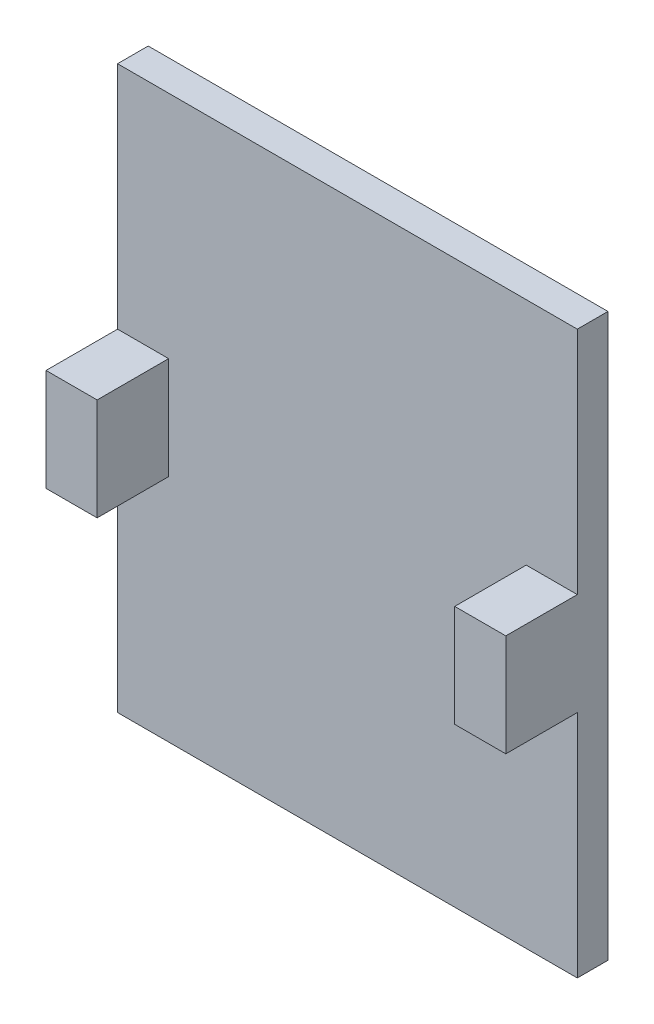
ISO-10303-21;
HEADER;
FILE_DESCRIPTION(('STEP AP214'),'2;1');
FILE_NAME('part.step','',(''),(''),'','','');
FILE_SCHEMA(('AUTOMOTIVE_DESIGN { 1 0 10303 214 1 1 1 1 }'));
ENDSEC;
DATA;
#1=APPLICATION_CONTEXT('core data for automotive mechanical design processes');
#2=APPLICATION_PROTOCOL_DEFINITION('international standard','automotive_design',2000,#1);
#3=PRODUCT_CONTEXT('',#1,'mechanical');
#4=PRODUCT('Part','Part','',(#3));
#5=PRODUCT_RELATED_PRODUCT_CATEGORY('part','',(#4));
#6=PRODUCT_DEFINITION_FORMATION('','',#4);
#7=PRODUCT_DEFINITION_CONTEXT('part definition',#1,'design');
#8=PRODUCT_DEFINITION('design','',#6,#7);
#9=PRODUCT_DEFINITION_SHAPE('','',#8);
#10=(LENGTH_UNIT() NAMED_UNIT(*) SI_UNIT(.MILLI.,.METRE.));
#11=(NAMED_UNIT(*) PLANE_ANGLE_UNIT() SI_UNIT($,.RADIAN.));
#12=(NAMED_UNIT(*) SI_UNIT($,.STERADIAN.) SOLID_ANGLE_UNIT());
#13=UNCERTAINTY_MEASURE_WITH_UNIT(LENGTH_MEASURE(1.E-05),#10,'distance_accuracy_value','');
#14=(GEOMETRIC_REPRESENTATION_CONTEXT(3) GLOBAL_UNCERTAINTY_ASSIGNED_CONTEXT((#13)) GLOBAL_UNIT_ASSIGNED_CONTEXT((#10,
#11,#12)) REPRESENTATION_CONTEXT('',''));
#15=CARTESIAN_POINT('',(0.,0.,0.));
#16=DIRECTION('',(0.,0.,1.));
#17=DIRECTION('',(1.,0.,0.));
#18=AXIS2_PLACEMENT_3D('',#15,#16,#17);
#19=CARTESIAN_POINT('',(0.,0.,3000.));
#20=DIRECTION('',(0.,0.,-1.));
#21=DIRECTION('',(-1.,0.,0.));
#22=AXIS2_PLACEMENT_3D('',#19,#20,#21);
#23=PLANE('',#22);
#24=DIRECTION('',(1.,0.,0.));
#25=VECTOR('',#24,1.);
#26=CARTESIAN_POINT('',(0.,-5000.,3000.));
#27=LINE('',#26,#25);
#28=CARTESIAN_POINT('',(-22500.,-5000.,3000.));
#29=VERTEX_POINT('',#28);
#30=CARTESIAN_POINT('',(-17500.,-5000.,3000.));
#31=VERTEX_POINT('',#30);
#32=EDGE_CURVE('E186',#29,#31,#27,.T.);
#33=ORIENTED_EDGE('',*,*,#32,.F.);
#34=DIRECTION('',(0.,-1.,0.));
#35=VECTOR('',#34,1.);
#36=CARTESIAN_POINT('',(-22500.,-27500.,3000.));
#37=LINE('',#36,#35);
#38=CARTESIAN_POINT('',(-22500.,-27500.,3000.));
#39=VERTEX_POINT('',#38);
#40=EDGE_CURVE('E149',#29,#39,#37,.T.);
#41=ORIENTED_EDGE('',*,*,#40,.T.);
#42=DIRECTION('',(1.,0.,0.));
#43=VECTOR('',#42,1.);
#44=CARTESIAN_POINT('',(-22500.,-27500.,3000.));
#45=LINE('',#44,#43);
#46=CARTESIAN_POINT('',(22500.,-27500.,3000.));
#47=VERTEX_POINT('',#46);
#48=EDGE_CURVE('E191',#39,#47,#45,.T.);
#49=ORIENTED_EDGE('',*,*,#48,.T.);
#50=DIRECTION('',(0.,1.,0.));
#51=VECTOR('',#50,1.);
#52=CARTESIAN_POINT('',(22500.,-27500.,3000.));
#53=LINE('',#52,#51);
#54=CARTESIAN_POINT('',(22500.,-5000.,3000.));
#55=VERTEX_POINT('',#54);
#56=EDGE_CURVE('E194',#47,#55,#53,.T.);
#57=ORIENTED_EDGE('',*,*,#56,.T.);
#58=DIRECTION('',(1.,0.,0.));
#59=VECTOR('',#58,1.);
#60=CARTESIAN_POINT('',(0.,-5000.,3000.));
#61=LINE('',#60,#59);
#62=CARTESIAN_POINT('',(17500.,-5000.,3000.));
#63=VERTEX_POINT('',#62);
#64=EDGE_CURVE('E153',#63,#55,#61,.T.);
#65=ORIENTED_EDGE('',*,*,#64,.F.);
#66=DIRECTION('',(0.,-1.,0.));
#67=VECTOR('',#66,1.);
#68=CARTESIAN_POINT('',(17500.,0.,3000.));
#69=LINE('',#68,#67);
#70=CARTESIAN_POINT('',(17500.,5000.,3000.));
#71=VERTEX_POINT('',#70);
#72=EDGE_CURVE('E181',#71,#63,#69,.T.);
#73=ORIENTED_EDGE('',*,*,#72,.F.);
#74=DIRECTION('',(-1.,0.,0.));
#75=VECTOR('',#74,1.);
#76=CARTESIAN_POINT('',(0.,5000.,3000.));
#77=LINE('',#76,#75);
#78=CARTESIAN_POINT('',(22500.,5000.,3000.));
#79=VERTEX_POINT('',#78);
#80=EDGE_CURVE('E150',#79,#71,#77,.T.);
#81=ORIENTED_EDGE('',*,*,#80,.F.);
#82=CARTESIAN_POINT('',(22500.,27500.,3000.));
#83=VERTEX_POINT('',#82);
#84=EDGE_CURVE('E193',#79,#83,#53,.T.);
#85=ORIENTED_EDGE('',*,*,#84,.T.);
#86=DIRECTION('',(-1.,0.,0.));
#87=VECTOR('',#86,1.);
#88=CARTESIAN_POINT('',(-22500.,27500.,3000.));
#89=LINE('',#88,#87);
#90=CARTESIAN_POINT('',(-22500.,27500.,3000.));
#91=VERTEX_POINT('',#90);
#92=EDGE_CURVE('E196',#83,#91,#89,.T.);
#93=ORIENTED_EDGE('',*,*,#92,.T.);
#94=CARTESIAN_POINT('',(-22500.,5000.,3000.));
#95=VERTEX_POINT('',#94);
#96=EDGE_CURVE('E189',#91,#95,#37,.T.);
#97=ORIENTED_EDGE('',*,*,#96,.T.);
#98=DIRECTION('',(-1.,0.,0.));
#99=VECTOR('',#98,1.);
#100=CARTESIAN_POINT('',(0.,5000.,3000.));
#101=LINE('',#100,#99);
#102=CARTESIAN_POINT('',(-17500.,5000.,3000.));
#103=VERTEX_POINT('',#102);
#104=EDGE_CURVE('E59',#103,#95,#101,.T.);
#105=ORIENTED_EDGE('',*,*,#104,.F.);
#106=DIRECTION('',(0.,1.,0.));
#107=VECTOR('',#106,1.);
#108=CARTESIAN_POINT('',(-17500.,0.,3000.));
#109=LINE('',#108,#107);
#110=EDGE_CURVE('E54',#31,#103,#109,.T.);
#111=ORIENTED_EDGE('',*,*,#110,.F.);
#112=EDGE_LOOP('',(#33,#41,#49,#57,#65,#73,#81,#85,#93,#97,#105,#111));
#113=FACE_BOUND('',#112,.T.);
#114=ADVANCED_FACE('F39',(#113),#23,.F.);
#115=CARTESIAN_POINT('',(-22500.,-27500.,3000.));
#116=DIRECTION('',(1.,0.,0.));
#117=DIRECTION('',(0.,0.,-1.));
#118=AXIS2_PLACEMENT_3D('',#115,#116,#117);
#119=PLANE('',#118);
#120=DIRECTION('',(0.,-1.,0.));
#121=VECTOR('',#120,1.);
#122=CARTESIAN_POINT('',(-22500.,-27500.,0.));
#123=LINE('',#122,#121);
#124=CARTESIAN_POINT('',(-22500.,27500.,0.));
#125=VERTEX_POINT('',#124);
#126=CARTESIAN_POINT('',(-22500.,-27500.,0.));
#127=VERTEX_POINT('',#126);
#128=EDGE_CURVE('E188',#125,#127,#123,.T.);
#129=ORIENTED_EDGE('',*,*,#128,.T.);
#130=DIRECTION('',(0.,0.,-1.));
#131=VECTOR('',#130,1.);
#132=CARTESIAN_POINT('',(-22500.,-27500.,3000.));
#133=LINE('',#132,#131);
#134=EDGE_CURVE('E11',#39,#127,#133,.T.);
#135=ORIENTED_EDGE('',*,*,#134,.F.);
#136=ORIENTED_EDGE('',*,*,#40,.F.);
#137=DIRECTION('',(0.,0.,-1.));
#138=VECTOR('',#137,1.);
#139=CARTESIAN_POINT('',(-22500.,-5000.,10000.));
#140=LINE('',#139,#138);
#141=CARTESIAN_POINT('',(-22500.,-5000.,10000.));
#142=VERTEX_POINT('',#141);
#143=EDGE_CURVE('E130',#142,#29,#140,.T.);
#144=ORIENTED_EDGE('',*,*,#143,.F.);
#145=DIRECTION('',(0.,-1.,0.));
#146=VECTOR('',#145,1.);
#147=CARTESIAN_POINT('',(-22500.,-5000.,10000.));
#148=LINE('',#147,#146);
#149=CARTESIAN_POINT('',(-22500.,5000.,10000.));
#150=VERTEX_POINT('',#149);
#151=EDGE_CURVE('E136',#150,#142,#148,.T.);
#152=ORIENTED_EDGE('',*,*,#151,.F.);
#153=DIRECTION('',(0.,0.,-1.));
#154=VECTOR('',#153,1.);
#155=CARTESIAN_POINT('',(-22500.,5000.,10000.));
#156=LINE('',#155,#154);
#157=EDGE_CURVE('E229',#150,#95,#156,.T.);
#158=ORIENTED_EDGE('',*,*,#157,.T.);
#159=ORIENTED_EDGE('',*,*,#96,.F.);
#160=DIRECTION('',(0.,0.,-1.));
#161=VECTOR('',#160,1.);
#162=CARTESIAN_POINT('',(-22500.,27500.,3000.));
#163=LINE('',#162,#161);
#164=EDGE_CURVE('E198',#91,#125,#163,.T.);
#165=ORIENTED_EDGE('',*,*,#164,.T.);
#166=EDGE_LOOP('',(#129,#135,#136,#144,#152,#158,#159,#165));
#167=FACE_BOUND('',#166,.T.);
#168=ADVANCED_FACE('F41',(#167),#119,.F.);
#169=CARTESIAN_POINT('',(-22500.,-27500.,3000.));
#170=DIRECTION('',(0.,1.,0.));
#171=DIRECTION('',(0.,0.,1.));
#172=AXIS2_PLACEMENT_3D('',#169,#170,#171);
#173=PLANE('',#172);
#174=DIRECTION('',(1.,0.,0.));
#175=VECTOR('',#174,1.);
#176=CARTESIAN_POINT('',(-22500.,-27500.,0.));
#177=LINE('',#176,#175);
#178=CARTESIAN_POINT('',(22500.,-27500.,0.));
#179=VERTEX_POINT('',#178);
#180=EDGE_CURVE('E200',#127,#179,#177,.T.);
#181=ORIENTED_EDGE('',*,*,#180,.T.);
#182=DIRECTION('',(0.,0.,-1.));
#183=VECTOR('',#182,1.);
#184=CARTESIAN_POINT('',(22500.,-27500.,3000.));
#185=LINE('',#184,#183);
#186=EDGE_CURVE('E47',#47,#179,#185,.T.);
#187=ORIENTED_EDGE('',*,*,#186,.F.);
#188=ORIENTED_EDGE('',*,*,#48,.F.);
#189=ORIENTED_EDGE('',*,*,#134,.T.);
#190=EDGE_LOOP('',(#181,#187,#188,#189));
#191=FACE_BOUND('',#190,.T.);
#192=ADVANCED_FACE('F254',(#191),#173,.F.);
#193=CARTESIAN_POINT('',(22500.,-27500.,3000.));
#194=DIRECTION('',(-1.,0.,0.));
#195=DIRECTION('',(0.,0.,1.));
#196=AXIS2_PLACEMENT_3D('',#193,#194,#195);
#197=PLANE('',#196);
#198=DIRECTION('',(0.,1.,0.));
#199=VECTOR('',#198,1.);
#200=CARTESIAN_POINT('',(22500.,-27500.,0.));
#201=LINE('',#200,#199);
#202=CARTESIAN_POINT('',(22500.,27500.,0.));
#203=VERTEX_POINT('',#202);
#204=EDGE_CURVE('E202',#179,#203,#201,.T.);
#205=ORIENTED_EDGE('',*,*,#204,.T.);
#206=DIRECTION('',(0.,0.,-1.));
#207=VECTOR('',#206,1.);
#208=CARTESIAN_POINT('',(22500.,27500.,3000.));
#209=LINE('',#208,#207);
#210=EDGE_CURVE('E208',#83,#203,#209,.T.);
#211=ORIENTED_EDGE('',*,*,#210,.F.);
#212=ORIENTED_EDGE('',*,*,#84,.F.);
#213=DIRECTION('',(0.,0.,-1.));
#214=VECTOR('',#213,1.);
#215=CARTESIAN_POINT('',(22500.,5000.,10000.));
#216=LINE('',#215,#214);
#217=CARTESIAN_POINT('',(22500.,5000.,10000.));
#218=VERTEX_POINT('',#217);
#219=EDGE_CURVE('E165',#218,#79,#216,.T.);
#220=ORIENTED_EDGE('',*,*,#219,.F.);
#221=DIRECTION('',(0.,1.,0.));
#222=VECTOR('',#221,1.);
#223=CARTESIAN_POINT('',(22500.,-5000.,10000.));
#224=LINE('',#223,#222);
#225=CARTESIAN_POINT('',(22500.,-5000.,10000.));
#226=VERTEX_POINT('',#225);
#227=EDGE_CURVE('E173',#226,#218,#224,.T.);
#228=ORIENTED_EDGE('',*,*,#227,.F.);
#229=DIRECTION('',(0.,0.,-1.));
#230=VECTOR('',#229,1.);
#231=CARTESIAN_POINT('',(22500.,-5000.,10000.));
#232=LINE('',#231,#230);
#233=EDGE_CURVE('E162',#226,#55,#232,.T.);
#234=ORIENTED_EDGE('',*,*,#233,.T.);
#235=ORIENTED_EDGE('',*,*,#56,.F.);
#236=ORIENTED_EDGE('',*,*,#186,.T.);
#237=EDGE_LOOP('',(#205,#211,#212,#220,#228,#234,#235,#236));
#238=FACE_BOUND('',#237,.T.);
#239=ADVANCED_FACE('F215',(#238),#197,.F.);
#240=CARTESIAN_POINT('',(-22500.,27500.,3000.));
#241=DIRECTION('',(0.,-1.,0.));
#242=DIRECTION('',(0.,0.,-1.));
#243=AXIS2_PLACEMENT_3D('',#240,#241,#242);
#244=PLANE('',#243);
#245=DIRECTION('',(-1.,0.,0.));
#246=VECTOR('',#245,1.);
#247=CARTESIAN_POINT('',(-22500.,27500.,0.));
#248=LINE('',#247,#246);
#249=EDGE_CURVE('E204',#203,#125,#248,.T.);
#250=ORIENTED_EDGE('',*,*,#249,.T.);
#251=ORIENTED_EDGE('',*,*,#164,.F.);
#252=ORIENTED_EDGE('',*,*,#92,.F.);
#253=ORIENTED_EDGE('',*,*,#210,.T.);
#254=EDGE_LOOP('',(#250,#251,#252,#253));
#255=FACE_BOUND('',#254,.T.);
#256=ADVANCED_FACE('F226',(#255),#244,.F.);
#257=CARTESIAN_POINT('',(0.,0.,0.));
#258=DIRECTION('',(0.,0.,-1.));
#259=DIRECTION('',(-1.,0.,0.));
#260=AXIS2_PLACEMENT_3D('',#257,#258,#259);
#261=PLANE('',#260);
#262=ORIENTED_EDGE('',*,*,#249,.F.);
#263=ORIENTED_EDGE('',*,*,#204,.F.);
#264=ORIENTED_EDGE('',*,*,#180,.F.);
#265=ORIENTED_EDGE('',*,*,#128,.F.);
#266=EDGE_LOOP('',(#262,#263,#264,#265));
#267=FACE_BOUND('',#266,.T.);
#268=ADVANCED_FACE('F222',(#267),#261,.T.);
#269=CARTESIAN_POINT('',(17500.,-5000.,10000.));
#270=DIRECTION('',(1.,0.,0.));
#271=DIRECTION('',(0.,0.,-1.));
#272=AXIS2_PLACEMENT_3D('',#269,#270,#271);
#273=PLANE('',#272);
#274=DIRECTION('',(0.,0.,-1.));
#275=VECTOR('',#274,1.);
#276=CARTESIAN_POINT('',(17500.,5000.,10000.));
#277=LINE('',#276,#275);
#278=CARTESIAN_POINT('',(17500.,5000.,10000.));
#279=VERTEX_POINT('',#278);
#280=EDGE_CURVE('E168',#279,#71,#277,.T.);
#281=ORIENTED_EDGE('',*,*,#280,.T.);
#282=ORIENTED_EDGE('',*,*,#72,.T.);
#283=DIRECTION('',(0.,0.,-1.));
#284=VECTOR('',#283,1.);
#285=CARTESIAN_POINT('',(17500.,-5000.,10000.));
#286=LINE('',#285,#284);
#287=CARTESIAN_POINT('',(17500.,-5000.,10000.));
#288=VERTEX_POINT('',#287);
#289=EDGE_CURVE('E159',#288,#63,#286,.T.);
#290=ORIENTED_EDGE('',*,*,#289,.F.);
#291=DIRECTION('',(0.,-1.,0.));
#292=VECTOR('',#291,1.);
#293=CARTESIAN_POINT('',(17500.,-5000.,10000.));
#294=LINE('',#293,#292);
#295=EDGE_CURVE('E145',#279,#288,#294,.T.);
#296=ORIENTED_EDGE('',*,*,#295,.F.);
#297=EDGE_LOOP('',(#281,#282,#290,#296));
#298=FACE_BOUND('',#297,.T.);
#299=ADVANCED_FACE('F260',(#298),#273,.F.);
#300=CARTESIAN_POINT('',(17500.,-5000.,10000.));
#301=DIRECTION('',(0.,1.,0.));
#302=DIRECTION('',(0.,0.,1.));
#303=AXIS2_PLACEMENT_3D('',#300,#301,#302);
#304=PLANE('',#303);
#305=ORIENTED_EDGE('',*,*,#289,.T.);
#306=ORIENTED_EDGE('',*,*,#64,.T.);
#307=ORIENTED_EDGE('',*,*,#233,.F.);
#308=DIRECTION('',(1.,0.,0.));
#309=VECTOR('',#308,1.);
#310=CARTESIAN_POINT('',(17500.,-5000.,10000.));
#311=LINE('',#310,#309);
#312=EDGE_CURVE('E175',#288,#226,#311,.T.);
#313=ORIENTED_EDGE('',*,*,#312,.F.);
#314=EDGE_LOOP('',(#305,#306,#307,#313));
#315=FACE_BOUND('',#314,.T.);
#316=ADVANCED_FACE('F268',(#315),#304,.F.);
#317=CARTESIAN_POINT('',(17500.,5000.,10000.));
#318=DIRECTION('',(0.,-1.,0.));
#319=DIRECTION('',(0.,0.,-1.));
#320=AXIS2_PLACEMENT_3D('',#317,#318,#319);
#321=PLANE('',#320);
#322=ORIENTED_EDGE('',*,*,#219,.T.);
#323=ORIENTED_EDGE('',*,*,#80,.T.);
#324=ORIENTED_EDGE('',*,*,#280,.F.);
#325=DIRECTION('',(-1.,0.,0.));
#326=VECTOR('',#325,1.);
#327=CARTESIAN_POINT('',(17500.,5000.,10000.));
#328=LINE('',#327,#326);
#329=EDGE_CURVE('E171',#218,#279,#328,.T.);
#330=ORIENTED_EDGE('',*,*,#329,.F.);
#331=EDGE_LOOP('',(#322,#323,#324,#330));
#332=FACE_BOUND('',#331,.T.);
#333=ADVANCED_FACE('F279',(#332),#321,.F.);
#334=CARTESIAN_POINT('',(0.,0.,10000.));
#335=DIRECTION('',(0.,0.,-1.));
#336=DIRECTION('',(-1.,0.,0.));
#337=AXIS2_PLACEMENT_3D('',#334,#335,#336);
#338=PLANE('',#337);
#339=ORIENTED_EDGE('',*,*,#295,.T.);
#340=ORIENTED_EDGE('',*,*,#312,.T.);
#341=ORIENTED_EDGE('',*,*,#227,.T.);
#342=ORIENTED_EDGE('',*,*,#329,.T.);
#343=EDGE_LOOP('',(#339,#340,#341,#342));
#344=FACE_BOUND('',#343,.T.);
#345=ADVANCED_FACE('F246',(#344),#338,.F.);
#346=CARTESIAN_POINT('',(-22500.,-5000.,10000.));
#347=DIRECTION('',(0.,1.,0.));
#348=DIRECTION('',(0.,0.,1.));
#349=AXIS2_PLACEMENT_3D('',#346,#347,#348);
#350=PLANE('',#349);
#351=ORIENTED_EDGE('',*,*,#143,.T.);
#352=ORIENTED_EDGE('',*,*,#32,.T.);
#353=DIRECTION('',(0.,0.,-1.));
#354=VECTOR('',#353,1.);
#355=CARTESIAN_POINT('',(-17500.,-5000.,10000.));
#356=LINE('',#355,#354);
#357=CARTESIAN_POINT('',(-17500.,-5000.,10000.));
#358=VERTEX_POINT('',#357);
#359=EDGE_CURVE('E132',#358,#31,#356,.T.);
#360=ORIENTED_EDGE('',*,*,#359,.F.);
#361=DIRECTION('',(1.,0.,0.));
#362=VECTOR('',#361,1.);
#363=CARTESIAN_POINT('',(-22500.,-5000.,10000.));
#364=LINE('',#363,#362);
#365=EDGE_CURVE('E126',#142,#358,#364,.T.);
#366=ORIENTED_EDGE('',*,*,#365,.F.);
#367=EDGE_LOOP('',(#351,#352,#360,#366));
#368=FACE_BOUND('',#367,.T.);
#369=ADVANCED_FACE('F128',(#368),#350,.F.);
#370=CARTESIAN_POINT('',(-17500.,-5000.,10000.));
#371=DIRECTION('',(-1.,0.,0.));
#372=DIRECTION('',(0.,0.,1.));
#373=AXIS2_PLACEMENT_3D('',#370,#371,#372);
#374=PLANE('',#373);
#375=ORIENTED_EDGE('',*,*,#359,.T.);
#376=ORIENTED_EDGE('',*,*,#110,.T.);
#377=DIRECTION('',(0.,0.,-1.));
#378=VECTOR('',#377,1.);
#379=CARTESIAN_POINT('',(-17500.,5000.,10000.));
#380=LINE('',#379,#378);
#381=CARTESIAN_POINT('',(-17500.,5000.,10000.));
#382=VERTEX_POINT('',#381);
#383=EDGE_CURVE('E155',#382,#103,#380,.T.);
#384=ORIENTED_EDGE('',*,*,#383,.F.);
#385=DIRECTION('',(0.,1.,0.));
#386=VECTOR('',#385,1.);
#387=CARTESIAN_POINT('',(-17500.,-5000.,10000.));
#388=LINE('',#387,#386);
#389=EDGE_CURVE('E135',#358,#382,#388,.T.);
#390=ORIENTED_EDGE('',*,*,#389,.F.);
#391=EDGE_LOOP('',(#375,#376,#384,#390));
#392=FACE_BOUND('',#391,.T.);
#393=ADVANCED_FACE('F238',(#392),#374,.F.);
#394=CARTESIAN_POINT('',(-22500.,5000.,10000.));
#395=DIRECTION('',(0.,-1.,0.));
#396=DIRECTION('',(0.,0.,-1.));
#397=AXIS2_PLACEMENT_3D('',#394,#395,#396);
#398=PLANE('',#397);
#399=ORIENTED_EDGE('',*,*,#383,.T.);
#400=ORIENTED_EDGE('',*,*,#104,.T.);
#401=ORIENTED_EDGE('',*,*,#157,.F.);
#402=DIRECTION('',(-1.,0.,0.));
#403=VECTOR('',#402,1.);
#404=CARTESIAN_POINT('',(-22500.,5000.,10000.));
#405=LINE('',#404,#403);
#406=EDGE_CURVE('E141',#382,#150,#405,.T.);
#407=ORIENTED_EDGE('',*,*,#406,.F.);
#408=EDGE_LOOP('',(#399,#400,#401,#407));
#409=FACE_BOUND('',#408,.T.);
#410=ADVANCED_FACE('F232',(#409),#398,.F.);
#411=CARTESIAN_POINT('',(0.,0.,10000.));
#412=DIRECTION('',(0.,0.,-1.));
#413=DIRECTION('',(-1.,0.,0.));
#414=AXIS2_PLACEMENT_3D('',#411,#412,#413);
#415=PLANE('',#414);
#416=ORIENTED_EDGE('',*,*,#151,.T.);
#417=ORIENTED_EDGE('',*,*,#365,.T.);
#418=ORIENTED_EDGE('',*,*,#389,.T.);
#419=ORIENTED_EDGE('',*,*,#406,.T.);
#420=EDGE_LOOP('',(#416,#417,#418,#419));
#421=FACE_BOUND('',#420,.T.);
#422=ADVANCED_FACE('F139',(#421),#415,.F.);
#423=CLOSED_SHELL('',(#114,#168,#192,#239,#256,#268,#299,#316,#333,#345,#369,#393,#410,#422));
#424=MANIFOLD_SOLID_BREP('B2',#423);
#425=ADVANCED_BREP_SHAPE_REPRESENTATION('',(#18,#424),#14);
#426=SHAPE_DEFINITION_REPRESENTATION(#9,#425);
ENDSEC;
END-ISO-10303-21;
